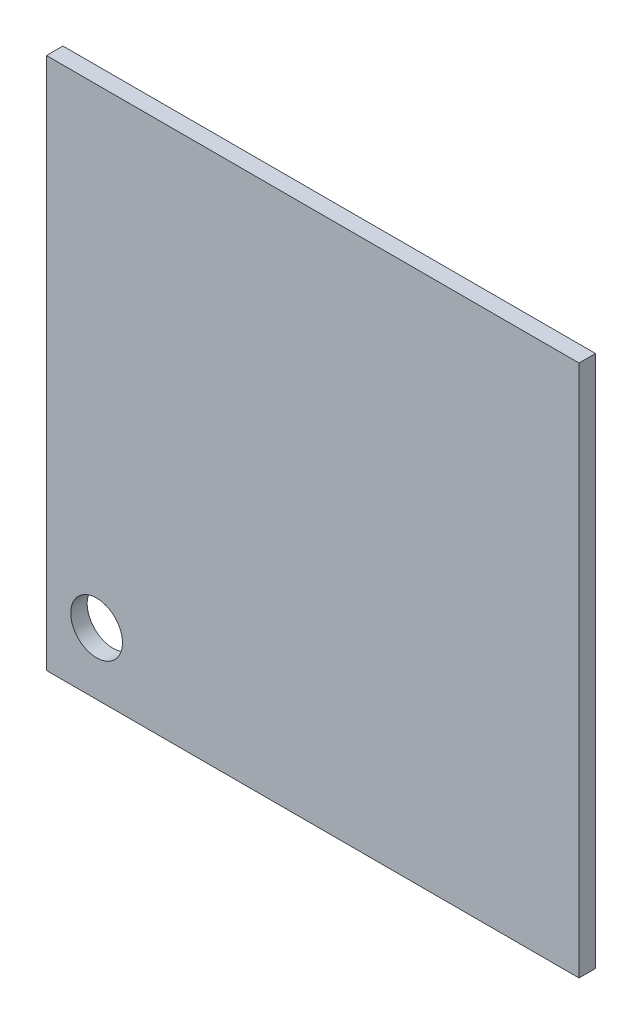
ISO-10303-21;
HEADER;
FILE_DESCRIPTION(('STEP AP214'),'2;1');
FILE_NAME('part.step','',(''),(''),'','','');
FILE_SCHEMA(('AUTOMOTIVE_DESIGN { 1 0 10303 214 1 1 1 1 }'));
ENDSEC;
DATA;
#1=APPLICATION_CONTEXT('core data for automotive mechanical design processes');
#2=APPLICATION_PROTOCOL_DEFINITION('international standard','automotive_design',2000,#1);
#3=PRODUCT_CONTEXT('',#1,'mechanical');
#4=PRODUCT('Part','Part','',(#3));
#5=PRODUCT_RELATED_PRODUCT_CATEGORY('part','',(#4));
#6=PRODUCT_DEFINITION_FORMATION('','',#4);
#7=PRODUCT_DEFINITION_CONTEXT('part definition',#1,'design');
#8=PRODUCT_DEFINITION('design','',#6,#7);
#9=PRODUCT_DEFINITION_SHAPE('','',#8);
#10=(LENGTH_UNIT() NAMED_UNIT(*) SI_UNIT(.MILLI.,.METRE.));
#11=(NAMED_UNIT(*) PLANE_ANGLE_UNIT() SI_UNIT($,.RADIAN.));
#12=(NAMED_UNIT(*) SI_UNIT($,.STERADIAN.) SOLID_ANGLE_UNIT());
#13=UNCERTAINTY_MEASURE_WITH_UNIT(LENGTH_MEASURE(1.E-05),#10,'distance_accuracy_value','');
#14=(GEOMETRIC_REPRESENTATION_CONTEXT(3) GLOBAL_UNCERTAINTY_ASSIGNED_CONTEXT((#13)) GLOBAL_UNIT_ASSIGNED_CONTEXT((#10,
#11,#12)) REPRESENTATION_CONTEXT('',''));
#15=CARTESIAN_POINT('',(0.,0.,0.));
#16=DIRECTION('',(0.,0.,1.));
#17=DIRECTION('',(1.,0.,0.));
#18=AXIS2_PLACEMENT_3D('',#15,#16,#17);
#19=CARTESIAN_POINT('',(-48.5,48.5,3.));
#20=DIRECTION('',(0.,-1.,0.));
#21=DIRECTION('',(1.,0.,0.));
#22=AXIS2_PLACEMENT_3D('',#19,#20,#21);
#23=PLANE('',#22);
#24=DIRECTION('',(-1.,0.,0.));
#25=VECTOR('',#24,1.);
#26=CARTESIAN_POINT('',(-48.5,48.5,0.));
#27=LINE('',#26,#25);
#28=CARTESIAN_POINT('',(48.5,48.5,0.));
#29=VERTEX_POINT('',#28);
#30=CARTESIAN_POINT('',(-48.5,48.5,0.));
#31=VERTEX_POINT('',#30);
#32=EDGE_CURVE('E102',#29,#31,#27,.T.);
#33=ORIENTED_EDGE('',*,*,#32,.T.);
#34=DIRECTION('',(0.,0.,-1.));
#35=VECTOR('',#34,1.);
#36=CARTESIAN_POINT('',(-48.5,48.5,3.));
#37=LINE('',#36,#35);
#38=CARTESIAN_POINT('',(-48.5,48.5,3.));
#39=VERTEX_POINT('',#38);
#40=EDGE_CURVE('E11',#39,#31,#37,.T.);
#41=ORIENTED_EDGE('',*,*,#40,.F.);
#42=DIRECTION('',(-1.,0.,0.));
#43=VECTOR('',#42,1.);
#44=CARTESIAN_POINT('',(-48.5,48.5,3.));
#45=LINE('',#44,#43);
#46=CARTESIAN_POINT('',(48.5,48.5,3.));
#47=VERTEX_POINT('',#46);
#48=EDGE_CURVE('E93',#47,#39,#45,.T.);
#49=ORIENTED_EDGE('',*,*,#48,.F.);
#50=DIRECTION('',(0.,0.,-1.));
#51=VECTOR('',#50,1.);
#52=CARTESIAN_POINT('',(48.5,48.5,3.));
#53=LINE('',#52,#51);
#54=EDGE_CURVE('E99',#47,#29,#53,.T.);
#55=ORIENTED_EDGE('',*,*,#54,.T.);
#56=EDGE_LOOP('',(#33,#41,#49,#55));
#57=FACE_BOUND('',#56,.T.);
#58=ADVANCED_FACE('F39',(#57),#23,.F.);
#59=CARTESIAN_POINT('',(-48.5,-48.5,3.));
#60=DIRECTION('',(1.,0.,0.));
#61=DIRECTION('',(0.,0.,-1.));
#62=AXIS2_PLACEMENT_3D('',#59,#60,#61);
#63=PLANE('',#62);
#64=DIRECTION('',(0.,-1.,0.));
#65=VECTOR('',#64,1.);
#66=CARTESIAN_POINT('',(-48.5,-48.5,0.));
#67=LINE('',#66,#65);
#68=CARTESIAN_POINT('',(-48.5,-48.5,0.));
#69=VERTEX_POINT('',#68);
#70=EDGE_CURVE('E92',#31,#69,#67,.T.);
#71=ORIENTED_EDGE('',*,*,#70,.T.);
#72=DIRECTION('',(0.,0.,-1.));
#73=VECTOR('',#72,1.);
#74=CARTESIAN_POINT('',(-48.5,-48.5,3.));
#75=LINE('',#74,#73);
#76=CARTESIAN_POINT('',(-48.5,-48.5,3.));
#77=VERTEX_POINT('',#76);
#78=EDGE_CURVE('E48',#77,#69,#75,.T.);
#79=ORIENTED_EDGE('',*,*,#78,.F.);
#80=DIRECTION('',(0.,-1.,0.));
#81=VECTOR('',#80,1.);
#82=CARTESIAN_POINT('',(-48.5,-48.5,3.));
#83=LINE('',#82,#81);
#84=EDGE_CURVE('E88',#39,#77,#83,.T.);
#85=ORIENTED_EDGE('',*,*,#84,.F.);
#86=ORIENTED_EDGE('',*,*,#40,.T.);
#87=EDGE_LOOP('',(#71,#79,#85,#86));
#88=FACE_BOUND('',#87,.T.);
#89=ADVANCED_FACE('F94',(#88),#63,.F.);
#90=CARTESIAN_POINT('',(-48.5,-48.5,3.));
#91=DIRECTION('',(0.,1.,0.));
#92=DIRECTION('',(-1.,0.,0.));
#93=AXIS2_PLACEMENT_3D('',#90,#91,#92);
#94=PLANE('',#93);
#95=DIRECTION('',(1.,0.,0.));
#96=VECTOR('',#95,1.);
#97=CARTESIAN_POINT('',(-48.5,-48.5,0.));
#98=LINE('',#97,#96);
#99=CARTESIAN_POINT('',(48.5,-48.5,0.));
#100=VERTEX_POINT('',#99);
#101=EDGE_CURVE('E71',#69,#100,#98,.T.);
#102=ORIENTED_EDGE('',*,*,#101,.T.);
#103=DIRECTION('',(0.,0.,-1.));
#104=VECTOR('',#103,1.);
#105=CARTESIAN_POINT('',(48.5,-48.5,3.));
#106=LINE('',#105,#104);
#107=CARTESIAN_POINT('',(48.5,-48.5,3.));
#108=VERTEX_POINT('',#107);
#109=EDGE_CURVE('E96',#108,#100,#106,.T.);
#110=ORIENTED_EDGE('',*,*,#109,.F.);
#111=DIRECTION('',(1.,0.,0.));
#112=VECTOR('',#111,1.);
#113=CARTESIAN_POINT('',(-48.5,-48.5,3.));
#114=LINE('',#113,#112);
#115=EDGE_CURVE('E90',#77,#108,#114,.T.);
#116=ORIENTED_EDGE('',*,*,#115,.F.);
#117=ORIENTED_EDGE('',*,*,#78,.T.);
#118=EDGE_LOOP('',(#102,#110,#116,#117));
#119=FACE_BOUND('',#118,.T.);
#120=ADVANCED_FACE('F98',(#119),#94,.F.);
#121=CARTESIAN_POINT('',(48.5,-48.5,3.));
#122=DIRECTION('',(-1.,0.,0.));
#123=DIRECTION('',(0.,0.,1.));
#124=AXIS2_PLACEMENT_3D('',#121,#122,#123);
#125=PLANE('',#124);
#126=DIRECTION('',(0.,1.,0.));
#127=VECTOR('',#126,1.);
#128=CARTESIAN_POINT('',(48.5,-48.5,0.));
#129=LINE('',#128,#127);
#130=EDGE_CURVE('E76',#100,#29,#129,.T.);
#131=ORIENTED_EDGE('',*,*,#130,.T.);
#132=ORIENTED_EDGE('',*,*,#54,.F.);
#133=DIRECTION('',(0.,1.,0.));
#134=VECTOR('',#133,1.);
#135=CARTESIAN_POINT('',(48.5,-48.5,3.));
#136=LINE('',#135,#134);
#137=EDGE_CURVE('E57',#108,#47,#136,.T.);
#138=ORIENTED_EDGE('',*,*,#137,.F.);
#139=ORIENTED_EDGE('',*,*,#109,.T.);
#140=EDGE_LOOP('',(#131,#132,#138,#139));
#141=FACE_BOUND('',#140,.T.);
#142=ADVANCED_FACE('F112',(#141),#125,.F.);
#143=CARTESIAN_POINT('',(0.,0.,3.));
#144=DIRECTION('',(0.,0.,1.));
#145=DIRECTION('',(1.,0.,0.));
#146=AXIS2_PLACEMENT_3D('',#143,#144,#145);
#147=PLANE('',#146);
#148=CARTESIAN_POINT('',(-39.3677291521854,-37.2184081276759,3.));
#149=DIRECTION('',(0.,0.,1.));
#150=DIRECTION('',(1.,0.,0.));
#151=AXIS2_PLACEMENT_3D('',#148,#149,#150);
#152=CIRCLE('',#151,4.71431064530731);
#153=CARTESIAN_POINT('',(-34.6534185068781,-37.2184081276759,3.));
#154=VERTEX_POINT('',#153);
#155=EDGE_CURVE('E120',#154,#154,#152,.T.);
#156=ORIENTED_EDGE('',*,*,#155,.F.);
#157=EDGE_LOOP('',(#156));
#158=FACE_BOUND('',#157,.T.);
#159=ORIENTED_EDGE('',*,*,#48,.T.);
#160=ORIENTED_EDGE('',*,*,#84,.T.);
#161=ORIENTED_EDGE('',*,*,#115,.T.);
#162=ORIENTED_EDGE('',*,*,#137,.T.);
#163=EDGE_LOOP('',(#159,#160,#161,#162));
#164=FACE_BOUND('',#163,.T.);
#165=ADVANCED_FACE('F87',(#158,#164),#147,.T.);
#166=CARTESIAN_POINT('',(0.,0.,0.));
#167=DIRECTION('',(0.,0.,1.));
#168=DIRECTION('',(1.,0.,0.));
#169=AXIS2_PLACEMENT_3D('',#166,#167,#168);
#170=PLANE('',#169);
#171=CARTESIAN_POINT('',(-39.3677291521854,-37.2184081276759,0.));
#172=DIRECTION('',(0.,0.,1.));
#173=DIRECTION('',(1.,0.,0.));
#174=AXIS2_PLACEMENT_3D('',#171,#172,#173);
#175=CIRCLE('',#174,4.71431064530731);
#176=CARTESIAN_POINT('',(-34.6534185068781,-37.2184081276759,0.));
#177=VERTEX_POINT('',#176);
#178=EDGE_CURVE('E45',#177,#177,#175,.T.);
#179=ORIENTED_EDGE('',*,*,#178,.T.);
#180=EDGE_LOOP('',(#179));
#181=FACE_BOUND('',#180,.T.);
#182=ORIENTED_EDGE('',*,*,#32,.F.);
#183=ORIENTED_EDGE('',*,*,#130,.F.);
#184=ORIENTED_EDGE('',*,*,#101,.F.);
#185=ORIENTED_EDGE('',*,*,#70,.F.);
#186=EDGE_LOOP('',(#182,#183,#184,#185));
#187=FACE_BOUND('',#186,.T.);
#188=ADVANCED_FACE('F111',(#181,#187),#170,.F.);
#189=CARTESIAN_POINT('',(-39.3677291521854,-37.2184081276759,-7.));
#190=DIRECTION('',(0.,0.,1.));
#191=DIRECTION('',(1.,0.,0.));
#192=AXIS2_PLACEMENT_3D('',#189,#190,#191);
#193=CYLINDRICAL_SURFACE('',#192,4.71431064530731);
#194=ORIENTED_EDGE('',*,*,#155,.T.);
#195=EDGE_LOOP('',(#194));
#196=FACE_BOUND('',#195,.T.);
#197=ORIENTED_EDGE('',*,*,#178,.F.);
#198=EDGE_LOOP('',(#197));
#199=FACE_BOUND('',#198,.T.);
#200=ADVANCED_FACE('F123',(#196,#199),#193,.F.);
#201=CLOSED_SHELL('',(#58,#89,#120,#142,#165,#188,#200));
#202=MANIFOLD_SOLID_BREP('B2',#201);
#203=ADVANCED_BREP_SHAPE_REPRESENTATION('',(#18,#202),#14);
#204=SHAPE_DEFINITION_REPRESENTATION(#9,#203);
ENDSEC;
END-ISO-10303-21;
